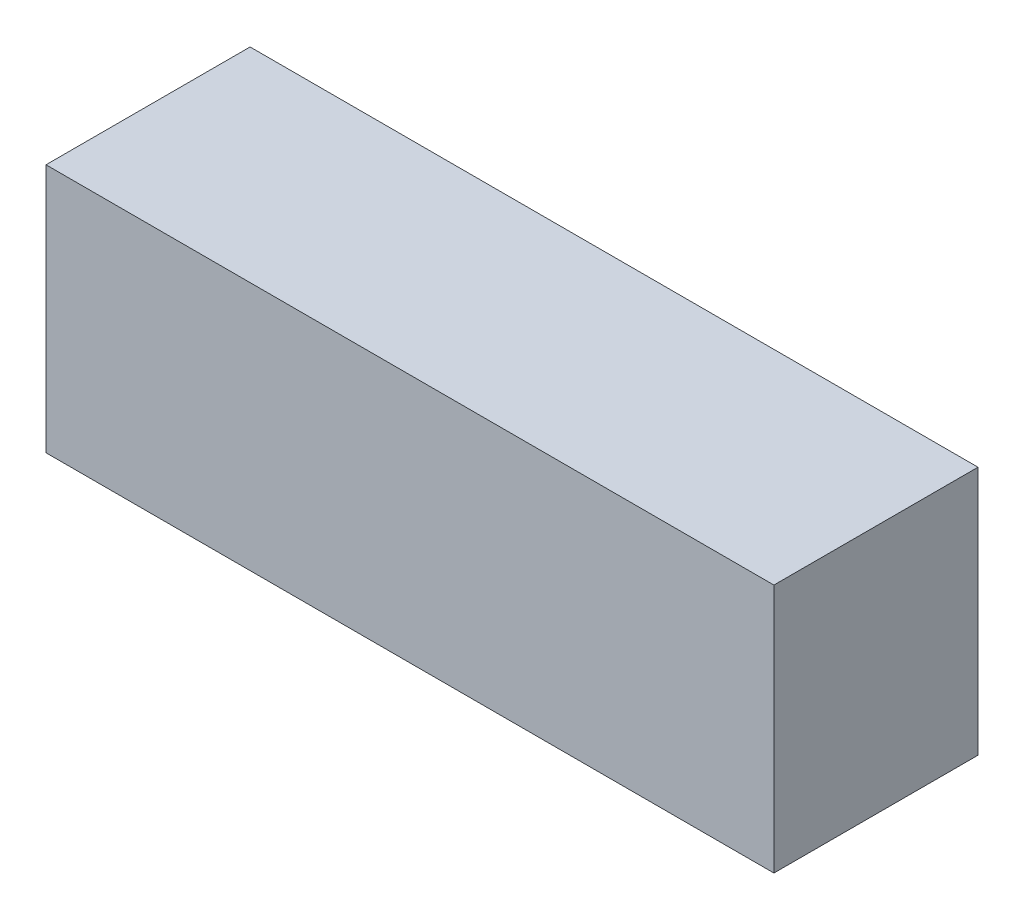
ISO-10303-21;
HEADER;
FILE_DESCRIPTION(('STEP AP214'),'2;1');
FILE_NAME('part.step','',(''),(''),'','','');
FILE_SCHEMA(('AUTOMOTIVE_DESIGN { 1 0 10303 214 1 1 1 1 }'));
ENDSEC;
DATA;
#1=APPLICATION_CONTEXT('core data for automotive mechanical design processes');
#2=APPLICATION_PROTOCOL_DEFINITION('international standard','automotive_design',2000,#1);
#3=PRODUCT_CONTEXT('',#1,'mechanical');
#4=PRODUCT('Part','Part','',(#3));
#5=PRODUCT_RELATED_PRODUCT_CATEGORY('part','',(#4));
#6=PRODUCT_DEFINITION_FORMATION('','',#4);
#7=PRODUCT_DEFINITION_CONTEXT('part definition',#1,'design');
#8=PRODUCT_DEFINITION('design','',#6,#7);
#9=PRODUCT_DEFINITION_SHAPE('','',#8);
#10=(LENGTH_UNIT() NAMED_UNIT(*) SI_UNIT(.MILLI.,.METRE.));
#11=(NAMED_UNIT(*) PLANE_ANGLE_UNIT() SI_UNIT($,.RADIAN.));
#12=(NAMED_UNIT(*) SI_UNIT($,.STERADIAN.) SOLID_ANGLE_UNIT());
#13=UNCERTAINTY_MEASURE_WITH_UNIT(LENGTH_MEASURE(1.E-05),#10,'distance_accuracy_value','');
#14=(GEOMETRIC_REPRESENTATION_CONTEXT(3) GLOBAL_UNCERTAINTY_ASSIGNED_CONTEXT((#13)) GLOBAL_UNIT_ASSIGNED_CONTEXT((#10,
#11,#12)) REPRESENTATION_CONTEXT('',''));
#15=CARTESIAN_POINT('',(0.,0.,0.));
#16=DIRECTION('',(0.,0.,1.));
#17=DIRECTION('',(1.,0.,0.));
#18=AXIS2_PLACEMENT_3D('',#15,#16,#17);
#19=CARTESIAN_POINT('',(-24.1863354037267,-11.8198757763975,18.));
#20=DIRECTION('',(1.,0.,0.));
#21=DIRECTION('',(0.,0.,-1.));
#22=AXIS2_PLACEMENT_3D('',#19,#20,#21);
#23=PLANE('',#22);
#24=DIRECTION('',(0.,-1.,0.));
#25=VECTOR('',#24,1.);
#26=CARTESIAN_POINT('',(-24.1863354037267,-11.8198757763975,0.));
#27=LINE('',#26,#25);
#28=CARTESIAN_POINT('',(-24.1863354037267,10.1801242236025,0.));
#29=VERTEX_POINT('',#28);
#30=CARTESIAN_POINT('',(-24.1863354037267,-11.8198757763975,0.));
#31=VERTEX_POINT('',#30);
#32=EDGE_CURVE('E96',#29,#31,#27,.T.);
#33=ORIENTED_EDGE('',*,*,#32,.T.);
#34=DIRECTION('',(0.,0.,-1.));
#35=VECTOR('',#34,1.);
#36=CARTESIAN_POINT('',(-24.1863354037267,-11.8198757763975,18.));
#37=LINE('',#36,#35);
#38=CARTESIAN_POINT('',(-24.1863354037267,-11.8198757763975,18.));
#39=VERTEX_POINT('',#38);
#40=EDGE_CURVE('E11',#39,#31,#37,.T.);
#41=ORIENTED_EDGE('',*,*,#40,.F.);
#42=DIRECTION('',(0.,-1.,0.));
#43=VECTOR('',#42,1.);
#44=CARTESIAN_POINT('',(-24.1863354037267,-11.8198757763975,18.));
#45=LINE('',#44,#43);
#46=CARTESIAN_POINT('',(-24.1863354037267,10.1801242236025,18.));
#47=VERTEX_POINT('',#46);
#48=EDGE_CURVE('E84',#47,#39,#45,.T.);
#49=ORIENTED_EDGE('',*,*,#48,.F.);
#50=DIRECTION('',(0.,0.,-1.));
#51=VECTOR('',#50,1.);
#52=CARTESIAN_POINT('',(-24.1863354037267,10.1801242236025,18.));
#53=LINE('',#52,#51);
#54=EDGE_CURVE('E92',#47,#29,#53,.T.);
#55=ORIENTED_EDGE('',*,*,#54,.T.);
#56=EDGE_LOOP('',(#33,#41,#49,#55));
#57=FACE_BOUND('',#56,.T.);
#58=ADVANCED_FACE('F33',(#57),#23,.F.);
#59=CARTESIAN_POINT('',(40.0136645962733,-11.8198757763975,18.));
#60=DIRECTION('',(0.,1.,0.));
#61=DIRECTION('',(-1.,0.,0.));
#62=AXIS2_PLACEMENT_3D('',#59,#60,#61);
#63=PLANE('',#62);
#64=DIRECTION('',(1.,0.,0.));
#65=VECTOR('',#64,1.);
#66=CARTESIAN_POINT('',(40.0136645962733,-11.8198757763975,0.));
#67=LINE('',#66,#65);
#68=CARTESIAN_POINT('',(40.0136645962733,-11.8198757763975,0.));
#69=VERTEX_POINT('',#68);
#70=EDGE_CURVE('E88',#31,#69,#67,.T.);
#71=ORIENTED_EDGE('',*,*,#70,.T.);
#72=DIRECTION('',(0.,0.,-1.));
#73=VECTOR('',#72,1.);
#74=CARTESIAN_POINT('',(40.0136645962733,-11.8198757763975,18.));
#75=LINE('',#74,#73);
#76=CARTESIAN_POINT('',(40.0136645962733,-11.8198757763975,18.));
#77=VERTEX_POINT('',#76);
#78=EDGE_CURVE('E41',#77,#69,#75,.T.);
#79=ORIENTED_EDGE('',*,*,#78,.F.);
#80=DIRECTION('',(1.,0.,0.));
#81=VECTOR('',#80,1.);
#82=CARTESIAN_POINT('',(40.0136645962733,-11.8198757763975,18.));
#83=LINE('',#82,#81);
#84=EDGE_CURVE('E79',#39,#77,#83,.T.);
#85=ORIENTED_EDGE('',*,*,#84,.F.);
#86=ORIENTED_EDGE('',*,*,#40,.T.);
#87=EDGE_LOOP('',(#71,#79,#85,#86));
#88=FACE_BOUND('',#87,.T.);
#89=ADVANCED_FACE('F87',(#88),#63,.F.);
#90=CARTESIAN_POINT('',(40.0136645962733,10.1801242236025,18.));
#91=DIRECTION('',(-1.,0.,0.));
#92=DIRECTION('',(0.,0.,1.));
#93=AXIS2_PLACEMENT_3D('',#90,#91,#92);
#94=PLANE('',#93);
#95=DIRECTION('',(0.,1.,0.));
#96=VECTOR('',#95,1.);
#97=CARTESIAN_POINT('',(40.0136645962733,10.1801242236025,0.));
#98=LINE('',#97,#96);
#99=CARTESIAN_POINT('',(40.0136645962733,10.1801242236025,0.));
#100=VERTEX_POINT('',#99);
#101=EDGE_CURVE('E66',#69,#100,#98,.T.);
#102=ORIENTED_EDGE('',*,*,#101,.T.);
#103=DIRECTION('',(0.,0.,-1.));
#104=VECTOR('',#103,1.);
#105=CARTESIAN_POINT('',(40.0136645962733,10.1801242236025,18.));
#106=LINE('',#105,#104);
#107=CARTESIAN_POINT('',(40.0136645962733,10.1801242236025,18.));
#108=VERTEX_POINT('',#107);
#109=EDGE_CURVE('E89',#108,#100,#106,.T.);
#110=ORIENTED_EDGE('',*,*,#109,.F.);
#111=DIRECTION('',(0.,1.,0.));
#112=VECTOR('',#111,1.);
#113=CARTESIAN_POINT('',(40.0136645962733,10.1801242236025,18.));
#114=LINE('',#113,#112);
#115=EDGE_CURVE('E82',#77,#108,#114,.T.);
#116=ORIENTED_EDGE('',*,*,#115,.F.);
#117=ORIENTED_EDGE('',*,*,#78,.T.);
#118=EDGE_LOOP('',(#102,#110,#116,#117));
#119=FACE_BOUND('',#118,.T.);
#120=ADVANCED_FACE('F90',(#119),#94,.F.);
#121=CARTESIAN_POINT('',(-24.1863354037267,10.1801242236025,18.));
#122=DIRECTION('',(0.,-1.,0.));
#123=DIRECTION('',(1.,0.,0.));
#124=AXIS2_PLACEMENT_3D('',#121,#122,#123);
#125=PLANE('',#124);
#126=DIRECTION('',(-1.,0.,0.));
#127=VECTOR('',#126,1.);
#128=CARTESIAN_POINT('',(-24.1863354037267,10.1801242236025,0.));
#129=LINE('',#128,#127);
#130=EDGE_CURVE('E72',#100,#29,#129,.T.);
#131=ORIENTED_EDGE('',*,*,#130,.T.);
#132=ORIENTED_EDGE('',*,*,#54,.F.);
#133=DIRECTION('',(-1.,0.,0.));
#134=VECTOR('',#133,1.);
#135=CARTESIAN_POINT('',(-24.1863354037267,10.1801242236025,18.));
#136=LINE('',#135,#134);
#137=EDGE_CURVE('E49',#108,#47,#136,.T.);
#138=ORIENTED_EDGE('',*,*,#137,.F.);
#139=ORIENTED_EDGE('',*,*,#109,.T.);
#140=EDGE_LOOP('',(#131,#132,#138,#139));
#141=FACE_BOUND('',#140,.T.);
#142=ADVANCED_FACE('F103',(#141),#125,.F.);
#143=CARTESIAN_POINT('',(0.,0.,18.));
#144=DIRECTION('',(0.,0.,-1.));
#145=DIRECTION('',(-1.,0.,0.));
#146=AXIS2_PLACEMENT_3D('',#143,#144,#145);
#147=PLANE('',#146);
#148=ORIENTED_EDGE('',*,*,#48,.T.);
#149=ORIENTED_EDGE('',*,*,#84,.T.);
#150=ORIENTED_EDGE('',*,*,#115,.T.);
#151=ORIENTED_EDGE('',*,*,#137,.T.);
#152=EDGE_LOOP('',(#148,#149,#150,#151));
#153=FACE_BOUND('',#152,.T.);
#154=ADVANCED_FACE('F80',(#153),#147,.F.);
#155=CARTESIAN_POINT('',(0.,0.,0.));
#156=DIRECTION('',(0.,0.,-1.));
#157=DIRECTION('',(-1.,0.,0.));
#158=AXIS2_PLACEMENT_3D('',#155,#156,#157);
#159=PLANE('',#158);
#160=ORIENTED_EDGE('',*,*,#32,.F.);
#161=ORIENTED_EDGE('',*,*,#130,.F.);
#162=ORIENTED_EDGE('',*,*,#101,.F.);
#163=ORIENTED_EDGE('',*,*,#70,.F.);
#164=EDGE_LOOP('',(#160,#161,#162,#163));
#165=FACE_BOUND('',#164,.T.);
#166=ADVANCED_FACE('F106',(#165),#159,.T.);
#167=CLOSED_SHELL('',(#58,#89,#120,#142,#154,#166));
#168=MANIFOLD_SOLID_BREP('B2',#167);
#169=ADVANCED_BREP_SHAPE_REPRESENTATION('',(#18,#168),#14);
#170=SHAPE_DEFINITION_REPRESENTATION(#9,#169);
ENDSEC;
END-ISO-10303-21;
